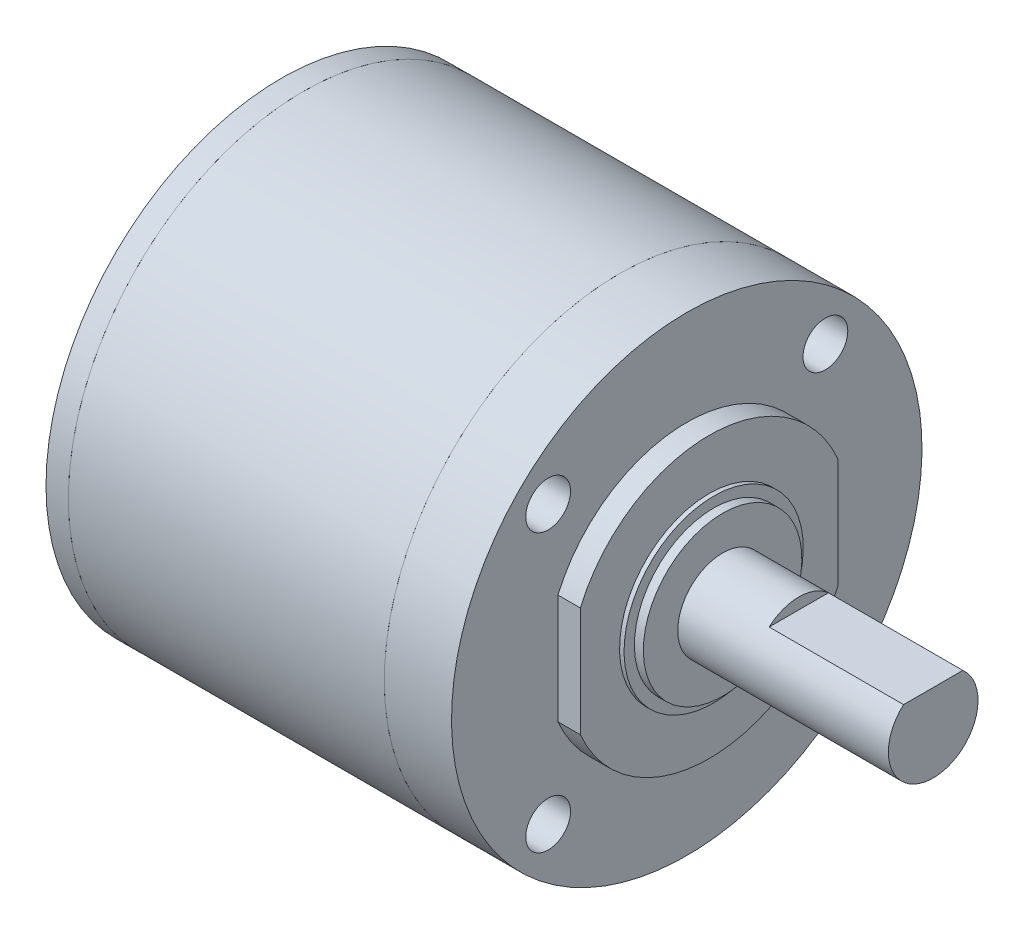
ISO-10303-21;
HEADER;
FILE_DESCRIPTION(('STEP AP214'),'2;1');
FILE_NAME('part.step','',(''),(''),'','','');
FILE_SCHEMA(('AUTOMOTIVE_DESIGN { 1 0 10303 214 1 1 1 1 }'));
ENDSEC;
DATA;
#1=APPLICATION_CONTEXT('core data for automotive mechanical design processes');
#2=APPLICATION_PROTOCOL_DEFINITION('international standard','automotive_design',2000,#1);
#3=PRODUCT_CONTEXT('',#1,'mechanical');
#4=PRODUCT('Part','Part','',(#3));
#5=PRODUCT_RELATED_PRODUCT_CATEGORY('part','',(#4));
#6=PRODUCT_DEFINITION_FORMATION('','',#4);
#7=PRODUCT_DEFINITION_CONTEXT('part definition',#1,'design');
#8=PRODUCT_DEFINITION('design','',#6,#7);
#9=PRODUCT_DEFINITION_SHAPE('','',#8);
#10=(LENGTH_UNIT() NAMED_UNIT(*) SI_UNIT(.MILLI.,.METRE.));
#11=(NAMED_UNIT(*) PLANE_ANGLE_UNIT() SI_UNIT($,.RADIAN.));
#12=(NAMED_UNIT(*) SI_UNIT($,.STERADIAN.) SOLID_ANGLE_UNIT());
#13=UNCERTAINTY_MEASURE_WITH_UNIT(LENGTH_MEASURE(1.E-05),#10,'distance_accuracy_value','');
#14=(GEOMETRIC_REPRESENTATION_CONTEXT(3) GLOBAL_UNCERTAINTY_ASSIGNED_CONTEXT((#13)) GLOBAL_UNIT_ASSIGNED_CONTEXT((#10,
#11,#12)) REPRESENTATION_CONTEXT('',''));
#15=CARTESIAN_POINT('',(0.,0.,0.));
#16=DIRECTION('',(0.,0.,1.));
#17=DIRECTION('',(1.,0.,0.));
#18=AXIS2_PLACEMENT_3D('',#15,#16,#17);
#19=CARTESIAN_POINT('',(33.2,0.,0.));
#20=DIRECTION('',(1.,0.,0.));
#21=DIRECTION('',(0.,0.,-1.));
#22=AXIS2_PLACEMENT_3D('',#19,#20,#21);
#23=PLANE('',#22);
#24=CARTESIAN_POINT('',(33.2,0.,0.));
#25=DIRECTION('',(1.,0.,0.));
#26=DIRECTION('',(0.,0.,-1.));
#27=AXIS2_PLACEMENT_3D('',#24,#25,#26);
#28=CIRCLE('',#27,21.);
#29=CARTESIAN_POINT('',(33.2,0.,-21.));
#30=VERTEX_POINT('',#29);
#31=EDGE_CURVE('P0_E10',#30,#30,#28,.T.);
#32=ORIENTED_EDGE('',*,*,#31,.T.);
#33=EDGE_LOOP('',(#32));
#34=FACE_BOUND('',#33,.T.);
#35=CARTESIAN_POINT('',(33.2,0.,0.));
#36=DIRECTION('',(1.,0.,0.));
#37=DIRECTION('',(0.,0.,-1.));
#38=AXIS2_PLACEMENT_3D('',#35,#36,#37);
#39=CIRCLE('',#38,17.725);
#40=CARTESIAN_POINT('',(33.2,0.,-17.725));
#41=VERTEX_POINT('',#40);
#42=EDGE_CURVE('P0_E26',#41,#41,#39,.T.);
#43=ORIENTED_EDGE('',*,*,#42,.F.);
#44=EDGE_LOOP('',(#43));
#45=FACE_BOUND('',#44,.T.);
#46=ADVANCED_FACE('P0_F15',(#34,#45),#23,.T.);
#47=CARTESIAN_POINT('',(5.,0.,0.));
#48=DIRECTION('',(1.,0.,0.));
#49=DIRECTION('',(0.,0.,-1.));
#50=AXIS2_PLACEMENT_3D('',#47,#48,#49);
#51=PLANE('',#50);
#52=CARTESIAN_POINT('',(5.,0.,0.));
#53=DIRECTION('',(1.,0.,0.));
#54=DIRECTION('',(0.,0.,-1.));
#55=AXIS2_PLACEMENT_3D('',#52,#53,#54);
#56=CIRCLE('',#55,21.);
#57=CARTESIAN_POINT('',(5.,0.,-21.));
#58=VERTEX_POINT('',#57);
#59=EDGE_CURVE('P0_E19',#58,#58,#56,.T.);
#60=ORIENTED_EDGE('',*,*,#59,.F.);
#61=EDGE_LOOP('',(#60));
#62=FACE_BOUND('',#61,.T.);
#63=CARTESIAN_POINT('',(5.,0.,0.));
#64=DIRECTION('',(1.,0.,0.));
#65=DIRECTION('',(0.,0.,-1.));
#66=AXIS2_PLACEMENT_3D('',#63,#64,#65);
#67=CIRCLE('',#66,17.725);
#68=CARTESIAN_POINT('',(5.,0.,-17.725));
#69=VERTEX_POINT('',#68);
#70=EDGE_CURVE('P0_E28',#69,#69,#67,.T.);
#71=ORIENTED_EDGE('',*,*,#70,.T.);
#72=EDGE_LOOP('',(#71));
#73=FACE_BOUND('',#72,.T.);
#74=ADVANCED_FACE('P0_F38',(#62,#73),#51,.F.);
#75=CARTESIAN_POINT('',(33.2,0.,0.));
#76=DIRECTION('',(-1.,0.,0.));
#77=DIRECTION('',(0.,0.,1.));
#78=AXIS2_PLACEMENT_3D('',#75,#76,#77);
#79=CYLINDRICAL_SURFACE('',#78,21.);
#80=ORIENTED_EDGE('',*,*,#31,.F.);
#81=EDGE_LOOP('',(#80));
#82=FACE_BOUND('',#81,.T.);
#83=ORIENTED_EDGE('',*,*,#59,.T.);
#84=EDGE_LOOP('',(#83));
#85=FACE_BOUND('',#84,.T.);
#86=ADVANCED_FACE('P0_F17',(#82,#85),#79,.T.);
#87=CARTESIAN_POINT('',(33.2,0.,0.));
#88=DIRECTION('',(-1.,0.,0.));
#89=DIRECTION('',(0.,0.,1.));
#90=AXIS2_PLACEMENT_3D('',#87,#88,#89);
#91=CYLINDRICAL_SURFACE('',#90,17.725);
#92=ORIENTED_EDGE('',*,*,#42,.T.);
#93=EDGE_LOOP('',(#92));
#94=FACE_BOUND('',#93,.T.);
#95=ORIENTED_EDGE('',*,*,#70,.F.);
#96=EDGE_LOOP('',(#95));
#97=FACE_BOUND('',#96,.T.);
#98=ADVANCED_FACE('P0_F34',(#94,#97),#91,.F.);
#99=CLOSED_SHELL('',(#46,#74,#86,#98));
#100=MANIFOLD_SOLID_BREP('P0_B1',#99);
#101=CARTESIAN_POINT('',(50.8618810344065,0.,0.));
#102=DIRECTION('',(1.,0.,0.));
#103=DIRECTION('',(0.,1.,0.));
#104=AXIS2_PLACEMENT_3D('',#101,#102,#103);
#105=CYLINDRICAL_SURFACE('',#104,12.5);
#106=DIRECTION('',(1.,0.,0.));
#107=VECTOR('',#106,1.);
#108=CARTESIAN_POINT('',(29.3511421982039,-4.89897948556637,-11.5));
#109=LINE('',#108,#107);
#110=CARTESIAN_POINT('',(39.2,-4.89897948556637,-11.5));
#111=VERTEX_POINT('',#110);
#112=CARTESIAN_POINT('',(41.2,-4.89897948556636,-11.5));
#113=VERTEX_POINT('',#112);
#114=EDGE_CURVE('P1_E111',#111,#113,#109,.T.);
#115=ORIENTED_EDGE('',*,*,#114,.T.);
#116=CARTESIAN_POINT('',(41.2,0.,0.));
#117=DIRECTION('',(1.,0.,0.));
#118=DIRECTION('',(0.,1.,0.));
#119=AXIS2_PLACEMENT_3D('',#116,#117,#118);
#120=CIRCLE('',#119,12.5);
#121=CARTESIAN_POINT('',(41.2,-4.89897948556637,11.5));
#122=VERTEX_POINT('',#121);
#123=EDGE_CURVE('P1_E121',#122,#113,#120,.T.);
#124=ORIENTED_EDGE('',*,*,#123,.F.);
#125=DIRECTION('',(1.,0.,0.));
#126=VECTOR('',#125,1.);
#127=CARTESIAN_POINT('',(29.3511421982039,-4.89897948556637,11.5));
#128=LINE('',#127,#126);
#129=CARTESIAN_POINT('',(39.2,-4.89897948556637,11.5));
#130=VERTEX_POINT('',#129);
#131=EDGE_CURVE('P1_E313',#130,#122,#128,.T.);
#132=ORIENTED_EDGE('',*,*,#131,.F.);
#133=CARTESIAN_POINT('',(39.2,0.,0.));
#134=DIRECTION('',(1.,0.,0.));
#135=DIRECTION('',(0.,1.,0.));
#136=AXIS2_PLACEMENT_3D('',#133,#134,#135);
#137=CIRCLE('',#136,12.5);
#138=EDGE_CURVE('P1_E125',#130,#111,#137,.T.);
#139=ORIENTED_EDGE('',*,*,#138,.T.);
#140=EDGE_LOOP('',(#115,#124,#132,#139));
#141=FACE_BOUND('',#140,.T.);
#142=ADVANCED_FACE('P1_F17',(#141),#105,.T.);
#143=CARTESIAN_POINT('',(41.2,12.5,0.));
#144=DIRECTION('',(1.,0.,0.));
#145=DIRECTION('',(0.,1.,0.));
#146=AXIS2_PLACEMENT_3D('',#143,#144,#145);
#147=PLANE('',#146);
#148=DIRECTION('',(0.,-1.,0.));
#149=VECTOR('',#148,1.);
#150=CARTESIAN_POINT('',(41.2,0.,-11.5));
#151=LINE('',#150,#149);
#152=CARTESIAN_POINT('',(41.2,4.89897948556636,-11.5));
#153=VERTEX_POINT('',#152);
#154=EDGE_CURVE('P1_E108',#153,#113,#151,.T.);
#155=ORIENTED_EDGE('',*,*,#154,.F.);
#156=CARTESIAN_POINT('',(41.2,4.89897948556637,11.5));
#157=VERTEX_POINT('',#156);
#158=EDGE_CURVE('P1_E118',#153,#157,#120,.T.);
#159=ORIENTED_EDGE('',*,*,#158,.T.);
#160=DIRECTION('',(0.,-1.,0.));
#161=VECTOR('',#160,1.);
#162=CARTESIAN_POINT('',(41.2,0.,11.5));
#163=LINE('',#162,#161);
#164=EDGE_CURVE('P1_E314',#157,#122,#163,.T.);
#165=ORIENTED_EDGE('',*,*,#164,.T.);
#166=ORIENTED_EDGE('',*,*,#123,.T.);
#167=EDGE_LOOP('',(#155,#159,#165,#166));
#168=FACE_BOUND('',#167,.T.);
#169=CARTESIAN_POINT('',(41.2,0.,0.));
#170=DIRECTION('',(1.,0.,0.));
#171=DIRECTION('',(0.,1.,0.));
#172=AXIS2_PLACEMENT_3D('',#169,#170,#171);
#173=CIRCLE('',#172,8.);
#174=CARTESIAN_POINT('',(41.2,8.,0.));
#175=VERTEX_POINT('',#174);
#176=EDGE_CURVE('P1_E127',#175,#175,#173,.T.);
#177=ORIENTED_EDGE('',*,*,#176,.F.);
#178=EDGE_LOOP('',(#177));
#179=FACE_BOUND('',#178,.T.);
#180=ADVANCED_FACE('P1_F115',(#168,#179),#147,.T.);
#181=DIRECTION('',(1.,0.,0.));
#182=VECTOR('',#181,1.);
#183=CARTESIAN_POINT('',(29.3511421982039,4.89897948556636,-11.5));
#184=LINE('',#183,#182);
#185=CARTESIAN_POINT('',(39.2,4.89897948556636,-11.5));
#186=VERTEX_POINT('',#185);
#187=EDGE_CURVE('P1_E105',#186,#153,#184,.T.);
#188=ORIENTED_EDGE('',*,*,#187,.F.);
#189=CARTESIAN_POINT('',(39.2,4.89897948556637,11.5));
#190=VERTEX_POINT('',#189);
#191=EDGE_CURVE('P1_E39',#186,#190,#137,.T.);
#192=ORIENTED_EDGE('',*,*,#191,.T.);
#193=DIRECTION('',(1.,0.,0.));
#194=VECTOR('',#193,1.);
#195=CARTESIAN_POINT('',(29.3511421982039,4.89897948556637,11.5));
#196=LINE('',#195,#194);
#197=EDGE_CURVE('P1_E124',#190,#157,#196,.T.);
#198=ORIENTED_EDGE('',*,*,#197,.T.);
#199=ORIENTED_EDGE('',*,*,#158,.F.);
#200=EDGE_LOOP('',(#188,#192,#198,#199));
#201=FACE_BOUND('',#200,.T.);
#202=ADVANCED_FACE('P1_F123',(#201),#105,.T.);
#203=CARTESIAN_POINT('',(50.8618810344065,0.,0.));
#204=DIRECTION('',(1.,0.,0.));
#205=DIRECTION('',(0.,1.,0.));
#206=AXIS2_PLACEMENT_3D('',#203,#204,#205);
#207=CYLINDRICAL_SURFACE('',#206,17.725);
#208=DIRECTION('',(-1.,0.,0.));
#209=VECTOR('',#208,1.);
#210=CARTESIAN_POINT('',(34.75,11.0416903167033,13.8656662281342));
#211=LINE('',#210,#209);
#212=CARTESIAN_POINT('',(27.1,11.0416903167033,13.8656662281342));
#213=VERTEX_POINT('',#212);
#214=CARTESIAN_POINT('',(33.2,11.0416903167033,13.8656662281342));
#215=VERTEX_POINT('',#214);
#216=EDGE_CURVE('P1_E309',#213,#215,#211,.F.);
#217=ORIENTED_EDGE('',*,*,#216,.F.);
#218=CARTESIAN_POINT('',(27.1,0.,0.));
#219=DIRECTION('',(1.,0.,0.));
#220=DIRECTION('',(0.,1.,0.));
#221=AXIS2_PLACEMENT_3D('',#218,#219,#220);
#222=CIRCLE('',#221,17.725);
#223=CARTESIAN_POINT('',(27.1,-11.0416903167033,13.8656662281342));
#224=VERTEX_POINT('',#223);
#225=EDGE_CURVE('P1_E273',#213,#224,#222,.T.);
#226=ORIENTED_EDGE('',*,*,#225,.T.);
#227=DIRECTION('',(-1.,0.,0.));
#228=VECTOR('',#227,1.);
#229=CARTESIAN_POINT('',(34.75,-11.0416903167033,13.8656662281342));
#230=LINE('',#229,#228);
#231=CARTESIAN_POINT('',(33.2,-11.0416903167033,13.8656662281342));
#232=VERTEX_POINT('',#231);
#233=EDGE_CURVE('P1_E149',#232,#224,#230,.T.);
#234=ORIENTED_EDGE('',*,*,#233,.F.);
#235=CARTESIAN_POINT('',(33.2,0.,0.));
#236=DIRECTION('',(1.,0.,0.));
#237=DIRECTION('',(0.,1.,0.));
#238=AXIS2_PLACEMENT_3D('',#235,#236,#237);
#239=CIRCLE('',#238,17.725);
#240=EDGE_CURVE('P1_E189',#215,#232,#239,.T.);
#241=ORIENTED_EDGE('',*,*,#240,.F.);
#242=EDGE_LOOP('',(#217,#226,#234,#241));
#243=FACE_BOUND('',#242,.T.);
#244=ADVANCED_FACE('P1_F225',(#243),#207,.T.);
#245=DIRECTION('',(-1.,0.,0.));
#246=VECTOR('',#245,1.);
#247=CARTESIAN_POINT('',(34.75,13.8656662281342,11.0416903167033));
#248=LINE('',#247,#246);
#249=CARTESIAN_POINT('',(33.2,13.8656662281342,11.0416903167033));
#250=VERTEX_POINT('',#249);
#251=CARTESIAN_POINT('',(27.1,13.8656662281342,11.0416903167033));
#252=VERTEX_POINT('',#251);
#253=EDGE_CURVE('P1_E275',#250,#252,#248,.T.);
#254=ORIENTED_EDGE('',*,*,#253,.F.);
#255=CARTESIAN_POINT('',(33.2,13.8656662281342,-11.0416903167033));
#256=VERTEX_POINT('',#255);
#257=EDGE_CURVE('P1_E186',#256,#250,#239,.T.);
#258=ORIENTED_EDGE('',*,*,#257,.F.);
#259=DIRECTION('',(-1.,0.,0.));
#260=VECTOR('',#259,1.);
#261=CARTESIAN_POINT('',(34.75,13.8656662281342,-11.0416903167033));
#262=LINE('',#261,#260);
#263=CARTESIAN_POINT('',(27.1,13.8656662281342,-11.0416903167033));
#264=VERTEX_POINT('',#263);
#265=EDGE_CURVE('P1_E164',#264,#256,#262,.F.);
#266=ORIENTED_EDGE('',*,*,#265,.F.);
#267=EDGE_CURVE('P1_E271',#264,#252,#222,.T.);
#268=ORIENTED_EDGE('',*,*,#267,.T.);
#269=EDGE_LOOP('',(#254,#258,#266,#268));
#270=FACE_BOUND('',#269,.T.);
#271=ADVANCED_FACE('P1_F230',(#270),#207,.T.);
#272=DIRECTION('',(-1.,0.,0.));
#273=VECTOR('',#272,1.);
#274=CARTESIAN_POINT('',(34.75,11.0416903167033,-13.8656662281342));
#275=LINE('',#274,#273);
#276=CARTESIAN_POINT('',(33.2,11.0416903167033,-13.8656662281342));
#277=VERTEX_POINT('',#276);
#278=CARTESIAN_POINT('',(27.1,11.0416903167033,-13.8656662281342));
#279=VERTEX_POINT('',#278);
#280=EDGE_CURVE('P1_E161',#277,#279,#275,.T.);
#281=ORIENTED_EDGE('',*,*,#280,.F.);
#282=CARTESIAN_POINT('',(33.2,-11.0416903167033,-13.8656662281342));
#283=VERTEX_POINT('',#282);
#284=EDGE_CURVE('P1_E174',#283,#277,#239,.T.);
#285=ORIENTED_EDGE('',*,*,#284,.F.);
#286=DIRECTION('',(-1.,0.,0.));
#287=VECTOR('',#286,1.);
#288=CARTESIAN_POINT('',(34.75,-11.0416903167033,-13.8656662281342));
#289=LINE('',#288,#287);
#290=CARTESIAN_POINT('',(27.1,-11.0416903167033,-13.8656662281342));
#291=VERTEX_POINT('',#290);
#292=EDGE_CURVE('P1_E156',#291,#283,#289,.F.);
#293=ORIENTED_EDGE('',*,*,#292,.F.);
#294=EDGE_CURVE('P1_E176',#291,#279,#222,.T.);
#295=ORIENTED_EDGE('',*,*,#294,.T.);
#296=EDGE_LOOP('',(#281,#285,#293,#295));
#297=FACE_BOUND('',#296,.T.);
#298=ADVANCED_FACE('P1_F172',(#297),#207,.T.);
#299=CARTESIAN_POINT('',(27.1,17.725,0.));
#300=DIRECTION('',(-1.,0.,0.));
#301=DIRECTION('',(0.,-1.,0.));
#302=AXIS2_PLACEMENT_3D('',#299,#300,#301);
#303=PLANE('',#302);
#304=CARTESIAN_POINT('',(27.1,12.3743686707646,12.3743686707646));
#305=DIRECTION('',(-1.,0.,0.));
#306=DIRECTION('',(0.,-1.,0.));
#307=AXIS2_PLACEMENT_3D('',#304,#305,#306);
#308=CIRCLE('',#307,2.);
#309=EDGE_CURVE('P1_E267',#252,#213,#308,.T.);
#310=ORIENTED_EDGE('',*,*,#309,.F.);
#311=ORIENTED_EDGE('',*,*,#267,.F.);
#312=CARTESIAN_POINT('',(27.1,12.3743686707646,-12.3743686707646));
#313=DIRECTION('',(-1.,0.,0.));
#314=DIRECTION('',(0.,-1.,0.));
#315=AXIS2_PLACEMENT_3D('',#312,#313,#314);
#316=CIRCLE('',#315,2.);
#317=EDGE_CURVE('P1_E177',#279,#264,#316,.T.);
#318=ORIENTED_EDGE('',*,*,#317,.F.);
#319=ORIENTED_EDGE('',*,*,#294,.F.);
#320=CARTESIAN_POINT('',(27.1,-12.3743686707646,-12.3743686707646));
#321=DIRECTION('',(-1.,0.,0.));
#322=DIRECTION('',(0.,-1.,0.));
#323=AXIS2_PLACEMENT_3D('',#320,#321,#322);
#324=CIRCLE('',#323,2.);
#325=CARTESIAN_POINT('',(27.1,-13.8656662281342,-11.0416903167033));
#326=VERTEX_POINT('',#325);
#327=EDGE_CURVE('P1_E299',#326,#291,#324,.T.);
#328=ORIENTED_EDGE('',*,*,#327,.F.);
#329=CARTESIAN_POINT('',(27.1,-13.8656662281342,11.0416903167033));
#330=VERTEX_POINT('',#329);
#331=EDGE_CURVE('P1_E192',#330,#326,#222,.T.);
#332=ORIENTED_EDGE('',*,*,#331,.F.);
#333=CARTESIAN_POINT('',(27.1,-12.3743686707646,12.3743686707646));
#334=DIRECTION('',(-1.,0.,0.));
#335=DIRECTION('',(0.,-1.,0.));
#336=AXIS2_PLACEMENT_3D('',#333,#334,#335);
#337=CIRCLE('',#336,2.);
#338=EDGE_CURVE('P1_E291',#224,#330,#337,.T.);
#339=ORIENTED_EDGE('',*,*,#338,.F.);
#340=ORIENTED_EDGE('',*,*,#225,.F.);
#341=EDGE_LOOP('',(#310,#311,#318,#319,#328,#332,#339,#340));
#342=FACE_BOUND('',#341,.T.);
#343=CARTESIAN_POINT('',(27.1,0.,0.));
#344=DIRECTION('',(1.,0.,0.));
#345=DIRECTION('',(0.,1.,0.));
#346=AXIS2_PLACEMENT_3D('',#343,#344,#345);
#347=CIRCLE('',#346,4.);
#348=CARTESIAN_POINT('',(27.1,4.,0.));
#349=VERTEX_POINT('',#348);
#350=EDGE_CURVE('P1_E146',#349,#349,#347,.T.);
#351=ORIENTED_EDGE('',*,*,#350,.T.);
#352=EDGE_LOOP('',(#351));
#353=FACE_BOUND('',#352,.T.);
#354=ADVANCED_FACE('P1_F19',(#342,#353),#303,.T.);
#355=CARTESIAN_POINT('',(50.8618810344065,0.,0.));
#356=DIRECTION('',(1.,0.,0.));
#357=DIRECTION('',(0.,1.,0.));
#358=AXIS2_PLACEMENT_3D('',#355,#356,#357);
#359=CYLINDRICAL_SURFACE('',#358,4.);
#360=CARTESIAN_POINT('',(42.4,0.,0.));
#361=DIRECTION('',(1.,0.,0.));
#362=DIRECTION('',(0.,1.,0.));
#363=AXIS2_PLACEMENT_3D('',#360,#361,#362);
#364=CIRCLE('',#363,4.);
#365=CARTESIAN_POINT('',(42.4,4.,0.));
#366=VERTEX_POINT('',#365);
#367=EDGE_CURVE('P1_E143',#366,#366,#364,.T.);
#368=ORIENTED_EDGE('',*,*,#367,.T.);
#369=EDGE_LOOP('',(#368));
#370=FACE_BOUND('',#369,.T.);
#371=ORIENTED_EDGE('',*,*,#350,.F.);
#372=EDGE_LOOP('',(#371));
#373=FACE_BOUND('',#372,.T.);
#374=ADVANCED_FACE('P1_F255',(#370,#373),#359,.F.);
#375=CARTESIAN_POINT('',(42.4,7.075,0.));
#376=DIRECTION('',(1.,0.,0.));
#377=DIRECTION('',(0.,1.,0.));
#378=AXIS2_PLACEMENT_3D('',#375,#376,#377);
#379=PLANE('',#378);
#380=CARTESIAN_POINT('',(42.4,0.,0.));
#381=DIRECTION('',(1.,0.,0.));
#382=DIRECTION('',(0.,1.,0.));
#383=AXIS2_PLACEMENT_3D('',#380,#381,#382);
#384=CIRCLE('',#383,7.075);
#385=CARTESIAN_POINT('',(42.4,7.075,0.));
#386=VERTEX_POINT('',#385);
#387=EDGE_CURVE('P1_E140',#386,#386,#384,.T.);
#388=ORIENTED_EDGE('',*,*,#387,.T.);
#389=EDGE_LOOP('',(#388));
#390=FACE_BOUND('',#389,.T.);
#391=ORIENTED_EDGE('',*,*,#367,.F.);
#392=EDGE_LOOP('',(#391));
#393=FACE_BOUND('',#392,.T.);
#394=ADVANCED_FACE('P1_F261',(#390,#393),#379,.T.);
#395=CARTESIAN_POINT('',(50.8618810344065,0.,0.));
#396=DIRECTION('',(1.,0.,0.));
#397=DIRECTION('',(0.,1.,0.));
#398=AXIS2_PLACEMENT_3D('',#395,#396,#397);
#399=CYLINDRICAL_SURFACE('',#398,7.075);
#400=CARTESIAN_POINT('',(41.6,0.,0.));
#401=DIRECTION('',(1.,0.,0.));
#402=DIRECTION('',(0.,1.,0.));
#403=AXIS2_PLACEMENT_3D('',#400,#401,#402);
#404=CIRCLE('',#403,7.075);
#405=CARTESIAN_POINT('',(41.6,7.075,0.));
#406=VERTEX_POINT('',#405);
#407=EDGE_CURVE('P1_E137',#406,#406,#404,.T.);
#408=ORIENTED_EDGE('',*,*,#407,.T.);
#409=EDGE_LOOP('',(#408));
#410=FACE_BOUND('',#409,.T.);
#411=ORIENTED_EDGE('',*,*,#387,.F.);
#412=EDGE_LOOP('',(#411));
#413=FACE_BOUND('',#412,.T.);
#414=ADVANCED_FACE('P1_F447',(#410,#413),#399,.T.);
#415=CARTESIAN_POINT('',(41.6,8.,0.));
#416=DIRECTION('',(1.,0.,0.));
#417=DIRECTION('',(0.,1.,0.));
#418=AXIS2_PLACEMENT_3D('',#415,#416,#417);
#419=PLANE('',#418);
#420=CARTESIAN_POINT('',(41.6,0.,0.));
#421=DIRECTION('',(1.,0.,0.));
#422=DIRECTION('',(0.,1.,0.));
#423=AXIS2_PLACEMENT_3D('',#420,#421,#422);
#424=CIRCLE('',#423,8.);
#425=CARTESIAN_POINT('',(41.6,8.,0.));
#426=VERTEX_POINT('',#425);
#427=EDGE_CURVE('P1_E134',#426,#426,#424,.T.);
#428=ORIENTED_EDGE('',*,*,#427,.T.);
#429=EDGE_LOOP('',(#428));
#430=FACE_BOUND('',#429,.T.);
#431=ORIENTED_EDGE('',*,*,#407,.F.);
#432=EDGE_LOOP('',(#431));
#433=FACE_BOUND('',#432,.T.);
#434=ADVANCED_FACE('P1_F436',(#430,#433),#419,.T.);
#435=CARTESIAN_POINT('',(50.8618810344065,0.,0.));
#436=DIRECTION('',(1.,0.,0.));
#437=DIRECTION('',(0.,1.,0.));
#438=AXIS2_PLACEMENT_3D('',#435,#436,#437);
#439=CYLINDRICAL_SURFACE('',#438,8.);
#440=ORIENTED_EDGE('',*,*,#176,.T.);
#441=EDGE_LOOP('',(#440));
#442=FACE_BOUND('',#441,.T.);
#443=ORIENTED_EDGE('',*,*,#427,.F.);
#444=EDGE_LOOP('',(#443));
#445=FACE_BOUND('',#444,.T.);
#446=ADVANCED_FACE('P1_F213',(#442,#445),#439,.T.);
#447=CARTESIAN_POINT('',(39.2,21.,0.));
#448=DIRECTION('',(1.,0.,0.));
#449=DIRECTION('',(0.,1.,0.));
#450=AXIS2_PLACEMENT_3D('',#447,#448,#449);
#451=PLANE('',#450);
#452=CARTESIAN_POINT('',(39.2,12.3743686707646,12.3743686707646));
#453=DIRECTION('',(1.,0.,0.));
#454=DIRECTION('',(0.,1.,0.));
#455=AXIS2_PLACEMENT_3D('',#452,#453,#454);
#456=CIRCLE('',#455,2.);
#457=CARTESIAN_POINT('',(39.2,14.3743686707646,12.3743686707646));
#458=VERTEX_POINT('',#457);
#459=EDGE_CURVE('P1_E306',#458,#458,#456,.T.);
#460=ORIENTED_EDGE('',*,*,#459,.F.);
#461=EDGE_LOOP('',(#460));
#462=FACE_BOUND('',#461,.T.);
#463=CARTESIAN_POINT('',(39.2,12.3743686707646,-12.3743686707646));
#464=DIRECTION('',(1.,0.,0.));
#465=DIRECTION('',(0.,1.,0.));
#466=AXIS2_PLACEMENT_3D('',#463,#464,#465);
#467=CIRCLE('',#466,2.);
#468=CARTESIAN_POINT('',(39.2,14.3743686707646,-12.3743686707646));
#469=VERTEX_POINT('',#468);
#470=EDGE_CURVE('P1_E301',#469,#469,#467,.T.);
#471=ORIENTED_EDGE('',*,*,#470,.F.);
#472=EDGE_LOOP('',(#471));
#473=FACE_BOUND('',#472,.T.);
#474=CARTESIAN_POINT('',(39.2,-12.3743686707646,-12.3743686707646));
#475=DIRECTION('',(1.,0.,0.));
#476=DIRECTION('',(0.,1.,0.));
#477=AXIS2_PLACEMENT_3D('',#474,#475,#476);
#478=CIRCLE('',#477,2.);
#479=CARTESIAN_POINT('',(39.2,-10.3743686707646,-12.3743686707646));
#480=VERTEX_POINT('',#479);
#481=EDGE_CURVE('P1_E293',#480,#480,#478,.T.);
#482=ORIENTED_EDGE('',*,*,#481,.F.);
#483=EDGE_LOOP('',(#482));
#484=FACE_BOUND('',#483,.T.);
#485=CARTESIAN_POINT('',(39.2,-12.3743686707646,12.3743686707646));
#486=DIRECTION('',(1.,0.,0.));
#487=DIRECTION('',(0.,1.,0.));
#488=AXIS2_PLACEMENT_3D('',#485,#486,#487);
#489=CIRCLE('',#488,2.);
#490=CARTESIAN_POINT('',(39.2,-10.3743686707646,12.3743686707646));
#491=VERTEX_POINT('',#490);
#492=EDGE_CURVE('P1_E279',#491,#491,#489,.T.);
#493=ORIENTED_EDGE('',*,*,#492,.F.);
#494=EDGE_LOOP('',(#493));
#495=FACE_BOUND('',#494,.T.);
#496=CARTESIAN_POINT('',(39.2,0.,0.));
#497=DIRECTION('',(1.,0.,0.));
#498=DIRECTION('',(0.,1.,0.));
#499=AXIS2_PLACEMENT_3D('',#496,#497,#498);
#500=CIRCLE('',#499,21.);
#501=CARTESIAN_POINT('',(39.2,21.,0.));
#502=VERTEX_POINT('',#501);
#503=EDGE_CURVE('P1_E195',#502,#502,#500,.T.);
#504=ORIENTED_EDGE('',*,*,#503,.T.);
#505=EDGE_LOOP('',(#504));
#506=FACE_BOUND('',#505,.T.);
#507=ORIENTED_EDGE('',*,*,#138,.F.);
#508=DIRECTION('',(0.,1.,0.));
#509=VECTOR('',#508,1.);
#510=CARTESIAN_POINT('',(39.2,0.,11.5));
#511=LINE('',#510,#509);
#512=EDGE_CURVE('P1_E276',#130,#190,#511,.T.);
#513=ORIENTED_EDGE('',*,*,#512,.T.);
#514=ORIENTED_EDGE('',*,*,#191,.F.);
#515=DIRECTION('',(0.,1.,0.));
#516=VECTOR('',#515,1.);
#517=CARTESIAN_POINT('',(39.2,0.,-11.5));
#518=LINE('',#517,#516);
#519=EDGE_CURVE('P1_E32',#111,#186,#518,.T.);
#520=ORIENTED_EDGE('',*,*,#519,.F.);
#521=EDGE_LOOP('',(#507,#513,#514,#520));
#522=FACE_BOUND('',#521,.T.);
#523=ADVANCED_FACE('P1_F199',(#462,#473,#484,#495,#506,#522),#451,.T.);
#524=CARTESIAN_POINT('',(50.8618810344065,0.,0.));
#525=DIRECTION('',(1.,0.,0.));
#526=DIRECTION('',(0.,1.,0.));
#527=AXIS2_PLACEMENT_3D('',#524,#525,#526);
#528=CYLINDRICAL_SURFACE('',#527,21.);
#529=CARTESIAN_POINT('',(33.2,0.,0.));
#530=DIRECTION('',(1.,0.,0.));
#531=DIRECTION('',(0.,1.,0.));
#532=AXIS2_PLACEMENT_3D('',#529,#530,#531);
#533=CIRCLE('',#532,21.);
#534=CARTESIAN_POINT('',(33.2,21.,0.));
#535=VERTEX_POINT('',#534);
#536=EDGE_CURVE('P1_E188',#535,#535,#533,.T.);
#537=ORIENTED_EDGE('',*,*,#536,.T.);
#538=EDGE_LOOP('',(#537));
#539=FACE_BOUND('',#538,.T.);
#540=ORIENTED_EDGE('',*,*,#503,.F.);
#541=EDGE_LOOP('',(#540));
#542=FACE_BOUND('',#541,.T.);
#543=ADVANCED_FACE('P1_F201',(#539,#542),#528,.T.);
#544=CARTESIAN_POINT('',(33.2,17.725,0.));
#545=DIRECTION('',(-1.,0.,0.));
#546=DIRECTION('',(0.,-1.,0.));
#547=AXIS2_PLACEMENT_3D('',#544,#545,#546);
#548=PLANE('',#547);
#549=CARTESIAN_POINT('',(33.2,12.3743686707646,12.3743686707646));
#550=DIRECTION('',(-1.,0.,0.));
#551=DIRECTION('',(0.,-1.,0.));
#552=AXIS2_PLACEMENT_3D('',#549,#550,#551);
#553=CIRCLE('',#552,2.);
#554=EDGE_CURVE('P1_E11',#215,#250,#553,.T.);
#555=ORIENTED_EDGE('',*,*,#554,.F.);
#556=ORIENTED_EDGE('',*,*,#240,.T.);
#557=CARTESIAN_POINT('',(33.2,-12.3743686707646,12.3743686707646));
#558=DIRECTION('',(-1.,0.,0.));
#559=DIRECTION('',(0.,-1.,0.));
#560=AXIS2_PLACEMENT_3D('',#557,#558,#559);
#561=CIRCLE('',#560,2.);
#562=CARTESIAN_POINT('',(33.2,-13.8656662281342,11.0416903167033));
#563=VERTEX_POINT('',#562);
#564=EDGE_CURVE('P1_E282',#563,#232,#561,.T.);
#565=ORIENTED_EDGE('',*,*,#564,.F.);
#566=CARTESIAN_POINT('',(33.2,-13.8656662281342,-11.0416903167033));
#567=VERTEX_POINT('',#566);
#568=EDGE_CURVE('P1_E185',#563,#567,#239,.T.);
#569=ORIENTED_EDGE('',*,*,#568,.T.);
#570=CARTESIAN_POINT('',(33.2,-12.3743686707646,-12.3743686707646));
#571=DIRECTION('',(-1.,0.,0.));
#572=DIRECTION('',(0.,-1.,0.));
#573=AXIS2_PLACEMENT_3D('',#570,#571,#572);
#574=CIRCLE('',#573,2.);
#575=EDGE_CURVE('P1_E184',#283,#567,#574,.T.);
#576=ORIENTED_EDGE('',*,*,#575,.F.);
#577=ORIENTED_EDGE('',*,*,#284,.T.);
#578=CARTESIAN_POINT('',(33.2,12.3743686707646,-12.3743686707646));
#579=DIRECTION('',(-1.,0.,0.));
#580=DIRECTION('',(0.,-1.,0.));
#581=AXIS2_PLACEMENT_3D('',#578,#579,#580);
#582=CIRCLE('',#581,2.);
#583=EDGE_CURVE('P1_E25',#256,#277,#582,.T.);
#584=ORIENTED_EDGE('',*,*,#583,.F.);
#585=ORIENTED_EDGE('',*,*,#257,.T.);
#586=EDGE_LOOP('',(#555,#556,#565,#569,#576,#577,#584,#585));
#587=FACE_BOUND('',#586,.T.);
#588=ORIENTED_EDGE('',*,*,#536,.F.);
#589=EDGE_LOOP('',(#588));
#590=FACE_BOUND('',#589,.T.);
#591=ADVANCED_FACE('P1_F181',(#587,#590),#548,.T.);
#592=DIRECTION('',(-1.,0.,0.));
#593=VECTOR('',#592,1.);
#594=CARTESIAN_POINT('',(34.75,-13.8656662281342,-11.0416903167033));
#595=LINE('',#594,#593);
#596=EDGE_CURVE('P1_E154',#567,#326,#595,.T.);
#597=ORIENTED_EDGE('',*,*,#596,.F.);
#598=ORIENTED_EDGE('',*,*,#568,.F.);
#599=DIRECTION('',(-1.,0.,0.));
#600=VECTOR('',#599,1.);
#601=CARTESIAN_POINT('',(34.75,-13.8656662281342,11.0416903167033));
#602=LINE('',#601,#600);
#603=EDGE_CURVE('P1_E152',#330,#563,#602,.F.);
#604=ORIENTED_EDGE('',*,*,#603,.F.);
#605=ORIENTED_EDGE('',*,*,#331,.T.);
#606=EDGE_LOOP('',(#597,#598,#604,#605));
#607=FACE_BOUND('',#606,.T.);
#608=ADVANCED_FACE('P1_F211',(#607),#207,.T.);
#609=CARTESIAN_POINT('',(42.4,-12.3743686707646,12.3743686707646));
#610=DIRECTION('',(-1.,0.,0.));
#611=DIRECTION('',(0.,-1.,0.));
#612=AXIS2_PLACEMENT_3D('',#609,#610,#611);
#613=CYLINDRICAL_SURFACE('',#612,2.);
#614=ORIENTED_EDGE('',*,*,#492,.T.);
#615=EDGE_LOOP('',(#614));
#616=FACE_BOUND('',#615,.T.);
#617=ORIENTED_EDGE('',*,*,#603,.T.);
#618=ORIENTED_EDGE('',*,*,#564,.T.);
#619=ORIENTED_EDGE('',*,*,#233,.T.);
#620=ORIENTED_EDGE('',*,*,#338,.T.);
#621=EDGE_LOOP('',(#617,#618,#619,#620));
#622=FACE_BOUND('',#621,.T.);
#623=ADVANCED_FACE('P1_F241',(#616,#622),#613,.F.);
#624=CARTESIAN_POINT('',(42.4,-12.3743686707646,-12.3743686707646));
#625=DIRECTION('',(-1.,0.,0.));
#626=DIRECTION('',(0.,-1.,0.));
#627=AXIS2_PLACEMENT_3D('',#624,#625,#626);
#628=CYLINDRICAL_SURFACE('',#627,2.);
#629=ORIENTED_EDGE('',*,*,#481,.T.);
#630=EDGE_LOOP('',(#629));
#631=FACE_BOUND('',#630,.T.);
#632=ORIENTED_EDGE('',*,*,#292,.T.);
#633=ORIENTED_EDGE('',*,*,#575,.T.);
#634=ORIENTED_EDGE('',*,*,#596,.T.);
#635=ORIENTED_EDGE('',*,*,#327,.T.);
#636=EDGE_LOOP('',(#632,#633,#634,#635));
#637=FACE_BOUND('',#636,.T.);
#638=ADVANCED_FACE('P1_F247',(#631,#637),#628,.F.);
#639=CARTESIAN_POINT('',(42.4,12.3743686707646,-12.3743686707646));
#640=DIRECTION('',(-1.,0.,0.));
#641=DIRECTION('',(0.,-1.,0.));
#642=AXIS2_PLACEMENT_3D('',#639,#640,#641);
#643=CYLINDRICAL_SURFACE('',#642,2.);
#644=ORIENTED_EDGE('',*,*,#470,.T.);
#645=EDGE_LOOP('',(#644));
#646=FACE_BOUND('',#645,.T.);
#647=ORIENTED_EDGE('',*,*,#265,.T.);
#648=ORIENTED_EDGE('',*,*,#583,.T.);
#649=ORIENTED_EDGE('',*,*,#280,.T.);
#650=ORIENTED_EDGE('',*,*,#317,.T.);
#651=EDGE_LOOP('',(#647,#648,#649,#650));
#652=FACE_BOUND('',#651,.T.);
#653=ADVANCED_FACE('P1_F160',(#646,#652),#643,.F.);
#654=CARTESIAN_POINT('',(42.4,12.3743686707646,12.3743686707646));
#655=DIRECTION('',(-1.,0.,0.));
#656=DIRECTION('',(0.,-1.,0.));
#657=AXIS2_PLACEMENT_3D('',#654,#655,#656);
#658=CYLINDRICAL_SURFACE('',#657,2.);
#659=ORIENTED_EDGE('',*,*,#459,.T.);
#660=EDGE_LOOP('',(#659));
#661=FACE_BOUND('',#660,.T.);
#662=ORIENTED_EDGE('',*,*,#216,.T.);
#663=ORIENTED_EDGE('',*,*,#554,.T.);
#664=ORIENTED_EDGE('',*,*,#253,.T.);
#665=ORIENTED_EDGE('',*,*,#309,.T.);
#666=EDGE_LOOP('',(#662,#663,#664,#665));
#667=FACE_BOUND('',#666,.T.);
#668=ADVANCED_FACE('P1_F324',(#661,#667),#658,.F.);
#669=CARTESIAN_POINT('',(29.3511421982039,0.,11.5));
#670=DIRECTION('',(0.,0.,1.));
#671=DIRECTION('',(1.,0.,0.));
#672=AXIS2_PLACEMENT_3D('',#669,#670,#671);
#673=PLANE('',#672);
#674=ORIENTED_EDGE('',*,*,#131,.T.);
#675=ORIENTED_EDGE('',*,*,#164,.F.);
#676=ORIENTED_EDGE('',*,*,#197,.F.);
#677=ORIENTED_EDGE('',*,*,#512,.F.);
#678=EDGE_LOOP('',(#674,#675,#676,#677));
#679=FACE_BOUND('',#678,.T.);
#680=ADVANCED_FACE('P1_F322',(#679),#673,.T.);
#681=CARTESIAN_POINT('',(29.3511421982039,0.,-11.5));
#682=DIRECTION('',(0.,0.,1.));
#683=DIRECTION('',(1.,0.,0.));
#684=AXIS2_PLACEMENT_3D('',#681,#682,#683);
#685=PLANE('',#684);
#686=ORIENTED_EDGE('',*,*,#519,.T.);
#687=ORIENTED_EDGE('',*,*,#187,.T.);
#688=ORIENTED_EDGE('',*,*,#154,.T.);
#689=ORIENTED_EDGE('',*,*,#114,.F.);
#690=EDGE_LOOP('',(#686,#687,#688,#689));
#691=FACE_BOUND('',#690,.T.);
#692=ADVANCED_FACE('P1_F107',(#691),#685,.F.);
#693=CLOSED_SHELL('',(#142,#180,#202,#244,#271,#298,#354,#374,#394,#414,#434,#446,#523,#543,
#591,#608,#623,#638,#653,#668,#680,#692));
#694=MANIFOLD_SOLID_BREP('P1_B1',#693);
#695=CARTESIAN_POINT('',(24.1,0.,0.));
#696=DIRECTION('',(1.,0.,0.));
#697=DIRECTION('',(0.,0.,-1.));
#698=AXIS2_PLACEMENT_3D('',#695,#696,#697);
#699=PLANE('',#698);
#700=CARTESIAN_POINT('',(24.1,0.,0.));
#701=DIRECTION('',(-1.,0.,0.));
#702=DIRECTION('',(0.,0.,1.));
#703=AXIS2_PLACEMENT_3D('',#700,#701,#702);
#704=CIRCLE('',#703,16.5);
#705=CARTESIAN_POINT('',(24.1,0.,16.5));
#706=VERTEX_POINT('',#705);
#707=EDGE_CURVE('P2_E11',#706,#706,#704,.T.);
#708=ORIENTED_EDGE('',*,*,#707,.T.);
#709=EDGE_LOOP('',(#708));
#710=FACE_BOUND('',#709,.T.);
#711=ADVANCED_FACE('P2_F17',(#710),#699,.F.);
#712=CARTESIAN_POINT('',(0.,0.,0.));
#713=DIRECTION('',(-1.,0.,0.));
#714=DIRECTION('',(0.,0.,1.));
#715=AXIS2_PLACEMENT_3D('',#712,#713,#714);
#716=CYLINDRICAL_SURFACE('',#715,16.5);
#717=ORIENTED_EDGE('',*,*,#707,.F.);
#718=EDGE_LOOP('',(#717));
#719=FACE_BOUND('',#718,.T.);
#720=CARTESIAN_POINT('',(27.1,0.,0.));
#721=DIRECTION('',(-1.,0.,0.));
#722=DIRECTION('',(0.,0.,1.));
#723=AXIS2_PLACEMENT_3D('',#720,#721,#722);
#724=CIRCLE('',#723,16.5);
#725=CARTESIAN_POINT('',(27.1,0.,16.5));
#726=VERTEX_POINT('',#725);
#727=EDGE_CURVE('P2_E24',#726,#726,#724,.T.);
#728=ORIENTED_EDGE('',*,*,#727,.T.);
#729=EDGE_LOOP('',(#728));
#730=FACE_BOUND('',#729,.T.);
#731=ADVANCED_FACE('P2_F64',(#719,#730),#716,.T.);
#732=CARTESIAN_POINT('',(27.1,16.5,0.));
#733=DIRECTION('',(-1.,0.,0.));
#734=DIRECTION('',(0.,0.,1.));
#735=AXIS2_PLACEMENT_3D('',#732,#733,#734);
#736=PLANE('',#735);
#737=ORIENTED_EDGE('',*,*,#727,.F.);
#738=EDGE_LOOP('',(#737));
#739=FACE_BOUND('',#738,.T.);
#740=CARTESIAN_POINT('',(27.1,0.,0.));
#741=DIRECTION('',(-1.,0.,0.));
#742=DIRECTION('',(0.,0.,1.));
#743=AXIS2_PLACEMENT_3D('',#740,#741,#742);
#744=CIRCLE('',#743,4.);
#745=CARTESIAN_POINT('',(27.1,0.,4.));
#746=VERTEX_POINT('',#745);
#747=EDGE_CURVE('P2_E56',#746,#746,#744,.T.);
#748=ORIENTED_EDGE('',*,*,#747,.T.);
#749=EDGE_LOOP('',(#748));
#750=FACE_BOUND('',#749,.T.);
#751=ADVANCED_FACE('P2_F66',(#739,#750),#736,.F.);
#752=CARTESIAN_POINT('',(0.,0.,0.));
#753=DIRECTION('',(-1.,0.,0.));
#754=DIRECTION('',(0.,0.,1.));
#755=AXIS2_PLACEMENT_3D('',#752,#753,#754);
#756=CYLINDRICAL_SURFACE('',#755,4.);
#757=CARTESIAN_POINT('',(61.2,0.,0.));
#758=DIRECTION('',(-1.,0.,0.));
#759=DIRECTION('',(0.,0.,1.));
#760=AXIS2_PLACEMENT_3D('',#757,#758,#759);
#761=CIRCLE('',#760,4.);
#762=CARTESIAN_POINT('',(61.2,3.,-2.64575131106458));
#763=VERTEX_POINT('',#762);
#764=CARTESIAN_POINT('',(61.2,3.,2.64575131106458));
#765=VERTEX_POINT('',#764);
#766=EDGE_CURVE('P2_E53',#763,#765,#761,.T.);
#767=ORIENTED_EDGE('',*,*,#766,.T.);
#768=DIRECTION('',(1.,0.,0.));
#769=VECTOR('',#768,1.);
#770=CARTESIAN_POINT('',(49.2,3.,2.64575131106458));
#771=LINE('',#770,#769);
#772=CARTESIAN_POINT('',(49.2,3.,2.64575131106458));
#773=VERTEX_POINT('',#772);
#774=EDGE_CURVE('P2_E31',#773,#765,#771,.T.);
#775=ORIENTED_EDGE('',*,*,#774,.F.);
#776=CARTESIAN_POINT('',(49.2,0.,0.));
#777=DIRECTION('',(1.,0.,0.));
#778=DIRECTION('',(0.,0.,-1.));
#779=AXIS2_PLACEMENT_3D('',#776,#777,#778);
#780=CIRCLE('',#779,4.);
#781=CARTESIAN_POINT('',(49.2,3.,-2.64575131106458));
#782=VERTEX_POINT('',#781);
#783=EDGE_CURVE('P2_E47',#782,#773,#780,.T.);
#784=ORIENTED_EDGE('',*,*,#783,.F.);
#785=DIRECTION('',(1.,0.,0.));
#786=VECTOR('',#785,1.);
#787=CARTESIAN_POINT('',(49.2,3.,-2.64575131106458));
#788=LINE('',#787,#786);
#789=EDGE_CURVE('P2_E37',#782,#763,#788,.T.);
#790=ORIENTED_EDGE('',*,*,#789,.T.);
#791=EDGE_LOOP('',(#767,#775,#784,#790));
#792=FACE_BOUND('',#791,.T.);
#793=ORIENTED_EDGE('',*,*,#747,.F.);
#794=EDGE_LOOP('',(#793));
#795=FACE_BOUND('',#794,.T.);
#796=ADVANCED_FACE('P2_F51',(#792,#795),#756,.T.);
#797=CARTESIAN_POINT('',(61.2,4.,0.));
#798=DIRECTION('',(-1.,0.,0.));
#799=DIRECTION('',(0.,0.,1.));
#800=AXIS2_PLACEMENT_3D('',#797,#798,#799);
#801=PLANE('',#800);
#802=ORIENTED_EDGE('',*,*,#766,.F.);
#803=DIRECTION('',(0.,0.,-1.));
#804=VECTOR('',#803,1.);
#805=CARTESIAN_POINT('',(61.2,3.,0.));
#806=LINE('',#805,#804);
#807=EDGE_CURVE('P2_E42',#765,#763,#806,.T.);
#808=ORIENTED_EDGE('',*,*,#807,.F.);
#809=EDGE_LOOP('',(#802,#808));
#810=FACE_BOUND('',#809,.T.);
#811=ADVANCED_FACE('P2_F55',(#810),#801,.F.);
#812=CARTESIAN_POINT('',(49.2,3.,0.));
#813=DIRECTION('',(0.,-1.,0.));
#814=DIRECTION('',(0.,0.,-1.));
#815=AXIS2_PLACEMENT_3D('',#812,#813,#814);
#816=PLANE('',#815);
#817=ORIENTED_EDGE('',*,*,#807,.T.);
#818=ORIENTED_EDGE('',*,*,#789,.F.);
#819=DIRECTION('',(0.,0.,-1.));
#820=VECTOR('',#819,1.);
#821=CARTESIAN_POINT('',(49.2,3.,0.));
#822=LINE('',#821,#820);
#823=EDGE_CURVE('P2_E133',#773,#782,#822,.T.);
#824=ORIENTED_EDGE('',*,*,#823,.F.);
#825=ORIENTED_EDGE('',*,*,#774,.T.);
#826=EDGE_LOOP('',(#817,#818,#824,#825));
#827=FACE_BOUND('',#826,.T.);
#828=ADVANCED_FACE('P2_F43',(#827),#816,.F.);
#829=CARTESIAN_POINT('',(49.2,0.,0.));
#830=DIRECTION('',(1.,0.,0.));
#831=DIRECTION('',(0.,0.,-1.));
#832=AXIS2_PLACEMENT_3D('',#829,#830,#831);
#833=PLANE('',#832);
#834=ORIENTED_EDGE('',*,*,#783,.T.);
#835=ORIENTED_EDGE('',*,*,#823,.T.);
#836=EDGE_LOOP('',(#834,#835));
#837=FACE_BOUND('',#836,.T.);
#838=ADVANCED_FACE('P2_F118',(#837),#833,.T.);
#839=CLOSED_SHELL('',(#711,#731,#751,#796,#811,#828,#838));
#840=MANIFOLD_SOLID_BREP('P2_B1',#839);
#841=CARTESIAN_POINT('',(0.,0.,0.));
#842=DIRECTION('',(-1.,0.,0.));
#843=DIRECTION('',(0.,0.,1.));
#844=AXIS2_PLACEMENT_3D('',#841,#842,#843);
#845=CYLINDRICAL_SURFACE('',#844,8.75);
#846=CARTESIAN_POINT('',(11.2,0.,0.));
#847=DIRECTION('',(-1.,0.,0.));
#848=DIRECTION('',(0.,0.,1.));
#849=AXIS2_PLACEMENT_3D('',#846,#847,#848);
#850=CIRCLE('',#849,8.75);
#851=CARTESIAN_POINT('',(11.2,0.,8.75));
#852=VERTEX_POINT('',#851);
#853=EDGE_CURVE('P3_E31',#852,#852,#850,.T.);
#854=ORIENTED_EDGE('',*,*,#853,.F.);
#855=EDGE_LOOP('',(#854));
#856=FACE_BOUND('',#855,.T.);
#857=CARTESIAN_POINT('',(3.,0.,0.));
#858=DIRECTION('',(-1.,0.,0.));
#859=DIRECTION('',(0.,0.,1.));
#860=AXIS2_PLACEMENT_3D('',#857,#858,#859);
#861=CIRCLE('',#860,8.75);
#862=CARTESIAN_POINT('',(3.,0.,8.75));
#863=VERTEX_POINT('',#862);
#864=EDGE_CURVE('P3_E46',#863,#863,#861,.F.);
#865=ORIENTED_EDGE('',*,*,#864,.F.);
#866=EDGE_LOOP('',(#865));
#867=FACE_BOUND('',#866,.T.);
#868=ADVANCED_FACE('P3_F15',(#856,#867),#845,.F.);
#869=CARTESIAN_POINT('',(0.,0.,0.));
#870=DIRECTION('',(-1.,0.,0.));
#871=DIRECTION('',(0.,0.,1.));
#872=AXIS2_PLACEMENT_3D('',#869,#870,#871);
#873=CYLINDRICAL_SURFACE('',#872,21.);
#874=CARTESIAN_POINT('',(5.,0.,0.));
#875=DIRECTION('',(-1.,0.,0.));
#876=DIRECTION('',(0.,0.,1.));
#877=AXIS2_PLACEMENT_3D('',#874,#875,#876);
#878=CIRCLE('',#877,21.);
#879=CARTESIAN_POINT('',(5.,0.,21.));
#880=VERTEX_POINT('',#879);
#881=EDGE_CURVE('P3_E10',#880,#880,#878,.T.);
#882=ORIENTED_EDGE('',*,*,#881,.T.);
#883=EDGE_LOOP('',(#882));
#884=FACE_BOUND('',#883,.T.);
#885=CARTESIAN_POINT('',(3.,0.,0.));
#886=DIRECTION('',(-1.,0.,0.));
#887=DIRECTION('',(0.,0.,1.));
#888=AXIS2_PLACEMENT_3D('',#885,#886,#887);
#889=CIRCLE('',#888,21.);
#890=CARTESIAN_POINT('',(3.,0.,21.));
#891=VERTEX_POINT('',#890);
#892=EDGE_CURVE('P3_E58',#891,#891,#889,.T.);
#893=ORIENTED_EDGE('',*,*,#892,.F.);
#894=EDGE_LOOP('',(#893));
#895=FACE_BOUND('',#894,.T.);
#896=ADVANCED_FACE('P3_F88',(#884,#895),#873,.T.);
#897=CARTESIAN_POINT('',(0.,14.5,0.));
#898=DIRECTION('',(1.,0.,0.));
#899=DIRECTION('',(0.,0.,-1.));
#900=AXIS2_PLACEMENT_3D('',#897,#898,#899);
#901=CYLINDRICAL_SURFACE('',#900,2.1);
#902=CARTESIAN_POINT('',(11.2,14.5,0.));
#903=DIRECTION('',(1.,0.,0.));
#904=DIRECTION('',(0.,0.,-1.));
#905=AXIS2_PLACEMENT_3D('',#902,#903,#904);
#906=CIRCLE('',#905,2.1);
#907=CARTESIAN_POINT('',(11.2,14.5,-2.1));
#908=VERTEX_POINT('',#907);
#909=EDGE_CURVE('P3_E34',#908,#908,#906,.T.);
#910=ORIENTED_EDGE('',*,*,#909,.T.);
#911=EDGE_LOOP('',(#910));
#912=FACE_BOUND('',#911,.T.);
#913=CARTESIAN_POINT('',(3.,14.5,0.));
#914=DIRECTION('',(-1.,0.,0.));
#915=DIRECTION('',(0.,0.,1.));
#916=AXIS2_PLACEMENT_3D('',#913,#914,#915);
#917=CIRCLE('',#916,2.1);
#918=CARTESIAN_POINT('',(3.,14.5,2.1));
#919=VERTEX_POINT('',#918);
#920=EDGE_CURVE('P3_E49',#919,#919,#917,.F.);
#921=ORIENTED_EDGE('',*,*,#920,.F.);
#922=EDGE_LOOP('',(#921));
#923=FACE_BOUND('',#922,.T.);
#924=ADVANCED_FACE('P3_F94',(#912,#923),#901,.F.);
#925=CARTESIAN_POINT('',(0.,0.,-12.5));
#926=DIRECTION('',(1.,0.,0.));
#927=DIRECTION('',(0.,0.,-1.));
#928=AXIS2_PLACEMENT_3D('',#925,#926,#927);
#929=CYLINDRICAL_SURFACE('',#928,1.6);
#930=CARTESIAN_POINT('',(11.2,0.,-12.5));
#931=DIRECTION('',(1.,0.,0.));
#932=DIRECTION('',(0.,0.,-1.));
#933=AXIS2_PLACEMENT_3D('',#930,#931,#932);
#934=CIRCLE('',#933,1.6);
#935=CARTESIAN_POINT('',(11.2,0.,-14.1));
#936=VERTEX_POINT('',#935);
#937=EDGE_CURVE('P3_E37',#936,#936,#934,.T.);
#938=ORIENTED_EDGE('',*,*,#937,.T.);
#939=EDGE_LOOP('',(#938));
#940=FACE_BOUND('',#939,.T.);
#941=CARTESIAN_POINT('',(3.,0.,-12.5));
#942=DIRECTION('',(-1.,0.,0.));
#943=DIRECTION('',(0.,0.,1.));
#944=AXIS2_PLACEMENT_3D('',#941,#942,#943);
#945=CIRCLE('',#944,1.6);
#946=CARTESIAN_POINT('',(3.,0.,-10.9));
#947=VERTEX_POINT('',#946);
#948=EDGE_CURVE('P3_E52',#947,#947,#945,.F.);
#949=ORIENTED_EDGE('',*,*,#948,.F.);
#950=EDGE_LOOP('',(#949));
#951=FACE_BOUND('',#950,.T.);
#952=ADVANCED_FACE('P3_F83',(#940,#951),#929,.F.);
#953=CARTESIAN_POINT('',(0.,-14.5,0.));
#954=DIRECTION('',(1.,0.,0.));
#955=DIRECTION('',(0.,0.,-1.));
#956=AXIS2_PLACEMENT_3D('',#953,#954,#955);
#957=CYLINDRICAL_SURFACE('',#956,2.1);
#958=CARTESIAN_POINT('',(11.2,-14.5,0.));
#959=DIRECTION('',(1.,0.,0.));
#960=DIRECTION('',(0.,0.,-1.));
#961=AXIS2_PLACEMENT_3D('',#958,#959,#960);
#962=CIRCLE('',#961,2.1);
#963=CARTESIAN_POINT('',(11.2,-14.5,-2.1));
#964=VERTEX_POINT('',#963);
#965=EDGE_CURVE('P3_E40',#964,#964,#962,.T.);
#966=ORIENTED_EDGE('',*,*,#965,.T.);
#967=EDGE_LOOP('',(#966));
#968=FACE_BOUND('',#967,.T.);
#969=CARTESIAN_POINT('',(3.,-14.5,0.));
#970=DIRECTION('',(-1.,0.,0.));
#971=DIRECTION('',(0.,0.,1.));
#972=AXIS2_PLACEMENT_3D('',#969,#970,#971);
#973=CIRCLE('',#972,2.1);
#974=CARTESIAN_POINT('',(3.,-14.5,2.1));
#975=VERTEX_POINT('',#974);
#976=EDGE_CURVE('P3_E55',#975,#975,#973,.F.);
#977=ORIENTED_EDGE('',*,*,#976,.F.);
#978=EDGE_LOOP('',(#977));
#979=FACE_BOUND('',#978,.T.);
#980=ADVANCED_FACE('P3_F71',(#968,#979),#957,.F.);
#981=CARTESIAN_POINT('',(0.,0.,12.5));
#982=DIRECTION('',(1.,0.,0.));
#983=DIRECTION('',(0.,0.,-1.));
#984=AXIS2_PLACEMENT_3D('',#981,#982,#983);
#985=CYLINDRICAL_SURFACE('',#984,1.6);
#986=CARTESIAN_POINT('',(11.2,0.,12.5));
#987=DIRECTION('',(1.,0.,0.));
#988=DIRECTION('',(0.,0.,-1.));
#989=AXIS2_PLACEMENT_3D('',#986,#987,#988);
#990=CIRCLE('',#989,1.6);
#991=CARTESIAN_POINT('',(11.2,0.,10.9));
#992=VERTEX_POINT('',#991);
#993=EDGE_CURVE('P3_E43',#992,#992,#990,.T.);
#994=ORIENTED_EDGE('',*,*,#993,.T.);
#995=EDGE_LOOP('',(#994));
#996=FACE_BOUND('',#995,.T.);
#997=CARTESIAN_POINT('',(3.,0.,12.5));
#998=DIRECTION('',(-1.,0.,0.));
#999=DIRECTION('',(0.,0.,1.));
#1000=AXIS2_PLACEMENT_3D('',#997,#998,#999);
#1001=CIRCLE('',#1000,1.6);
#1002=CARTESIAN_POINT('',(3.,0.,14.1));
#1003=VERTEX_POINT('',#1002);
#1004=EDGE_CURVE('P3_E18',#1003,#1003,#1001,.F.);
#1005=ORIENTED_EDGE('',*,*,#1004,.F.);
#1006=EDGE_LOOP('',(#1005));
#1007=FACE_BOUND('',#1006,.T.);
#1008=ADVANCED_FACE('P3_F68',(#996,#1007),#985,.F.);
#1009=CARTESIAN_POINT('',(5.,21.,0.));
#1010=DIRECTION('',(-1.,0.,0.));
#1011=DIRECTION('',(0.,0.,1.));
#1012=AXIS2_PLACEMENT_3D('',#1009,#1010,#1011);
#1013=PLANE('',#1012);
#1014=ORIENTED_EDGE('',*,*,#881,.F.);
#1015=EDGE_LOOP('',(#1014));
#1016=FACE_BOUND('',#1015,.T.);
#1017=CARTESIAN_POINT('',(5.,0.,0.));
#1018=DIRECTION('',(-1.,0.,0.));
#1019=DIRECTION('',(0.,0.,1.));
#1020=AXIS2_PLACEMENT_3D('',#1017,#1018,#1019);
#1021=CIRCLE('',#1020,17.725);
#1022=CARTESIAN_POINT('',(5.,0.,17.725));
#1023=VERTEX_POINT('',#1022);
#1024=EDGE_CURVE('P3_E22',#1023,#1023,#1021,.T.);
#1025=ORIENTED_EDGE('',*,*,#1024,.T.);
#1026=EDGE_LOOP('',(#1025));
#1027=FACE_BOUND('',#1026,.T.);
#1028=ADVANCED_FACE('P3_F70',(#1016,#1027),#1013,.F.);
#1029=CARTESIAN_POINT('',(0.,0.,0.));
#1030=DIRECTION('',(-1.,0.,0.));
#1031=DIRECTION('',(0.,0.,1.));
#1032=AXIS2_PLACEMENT_3D('',#1029,#1030,#1031);
#1033=CYLINDRICAL_SURFACE('',#1032,17.725);
#1034=ORIENTED_EDGE('',*,*,#1024,.F.);
#1035=EDGE_LOOP('',(#1034));
#1036=FACE_BOUND('',#1035,.T.);
#1037=CARTESIAN_POINT('',(11.2,0.,0.));
#1038=DIRECTION('',(-1.,0.,0.));
#1039=DIRECTION('',(0.,0.,1.));
#1040=AXIS2_PLACEMENT_3D('',#1037,#1038,#1039);
#1041=CIRCLE('',#1040,17.725);
#1042=CARTESIAN_POINT('',(11.2,0.,17.725));
#1043=VERTEX_POINT('',#1042);
#1044=EDGE_CURVE('P3_E26',#1043,#1043,#1041,.T.);
#1045=ORIENTED_EDGE('',*,*,#1044,.T.);
#1046=EDGE_LOOP('',(#1045));
#1047=FACE_BOUND('',#1046,.T.);
#1048=ADVANCED_FACE('P3_F80',(#1036,#1047),#1033,.T.);
#1049=CARTESIAN_POINT('',(11.2,17.725,0.));
#1050=DIRECTION('',(-1.,0.,0.));
#1051=DIRECTION('',(0.,0.,1.));
#1052=AXIS2_PLACEMENT_3D('',#1049,#1050,#1051);
#1053=PLANE('',#1052);
#1054=ORIENTED_EDGE('',*,*,#993,.F.);
#1055=EDGE_LOOP('',(#1054));
#1056=FACE_BOUND('',#1055,.T.);
#1057=ORIENTED_EDGE('',*,*,#965,.F.);
#1058=EDGE_LOOP('',(#1057));
#1059=FACE_BOUND('',#1058,.T.);
#1060=ORIENTED_EDGE('',*,*,#937,.F.);
#1061=EDGE_LOOP('',(#1060));
#1062=FACE_BOUND('',#1061,.T.);
#1063=ORIENTED_EDGE('',*,*,#909,.F.);
#1064=EDGE_LOOP('',(#1063));
#1065=FACE_BOUND('',#1064,.T.);
#1066=ORIENTED_EDGE('',*,*,#1044,.F.);
#1067=EDGE_LOOP('',(#1066));
#1068=FACE_BOUND('',#1067,.T.);
#1069=ORIENTED_EDGE('',*,*,#853,.T.);
#1070=EDGE_LOOP('',(#1069));
#1071=FACE_BOUND('',#1070,.T.);
#1072=ADVANCED_FACE('P3_F100',(#1056,#1059,#1062,#1065,#1068,#1071),#1053,.F.);
#1073=CARTESIAN_POINT('',(3.,0.,0.));
#1074=DIRECTION('',(-1.,0.,0.));
#1075=DIRECTION('',(0.,0.,1.));
#1076=AXIS2_PLACEMENT_3D('',#1073,#1074,#1075);
#1077=PLANE('',#1076);
#1078=ORIENTED_EDGE('',*,*,#892,.T.);
#1079=EDGE_LOOP('',(#1078));
#1080=FACE_BOUND('',#1079,.T.);
#1081=ORIENTED_EDGE('',*,*,#1004,.T.);
#1082=EDGE_LOOP('',(#1081));
#1083=FACE_BOUND('',#1082,.T.);
#1084=ORIENTED_EDGE('',*,*,#976,.T.);
#1085=EDGE_LOOP('',(#1084));
#1086=FACE_BOUND('',#1085,.T.);
#1087=ORIENTED_EDGE('',*,*,#948,.T.);
#1088=EDGE_LOOP('',(#1087));
#1089=FACE_BOUND('',#1088,.T.);
#1090=ORIENTED_EDGE('',*,*,#920,.T.);
#1091=EDGE_LOOP('',(#1090));
#1092=FACE_BOUND('',#1091,.T.);
#1093=ORIENTED_EDGE('',*,*,#864,.T.);
#1094=EDGE_LOOP('',(#1093));
#1095=FACE_BOUND('',#1094,.T.);
#1096=ADVANCED_FACE('P3_F65',(#1080,#1083,#1086,#1089,#1092,#1095),#1077,.T.);
#1097=CLOSED_SHELL('',(#868,#896,#924,#952,#980,#1008,#1028,#1048,#1072,#1096));
#1098=MANIFOLD_SOLID_BREP('P3_B1',#1097);
#1099=ADVANCED_BREP_SHAPE_REPRESENTATION('',(#18,#100,#694,#840,#1098),#14);
#1100=SHAPE_DEFINITION_REPRESENTATION(#9,#1099);
ENDSEC;
END-ISO-10303-21;
